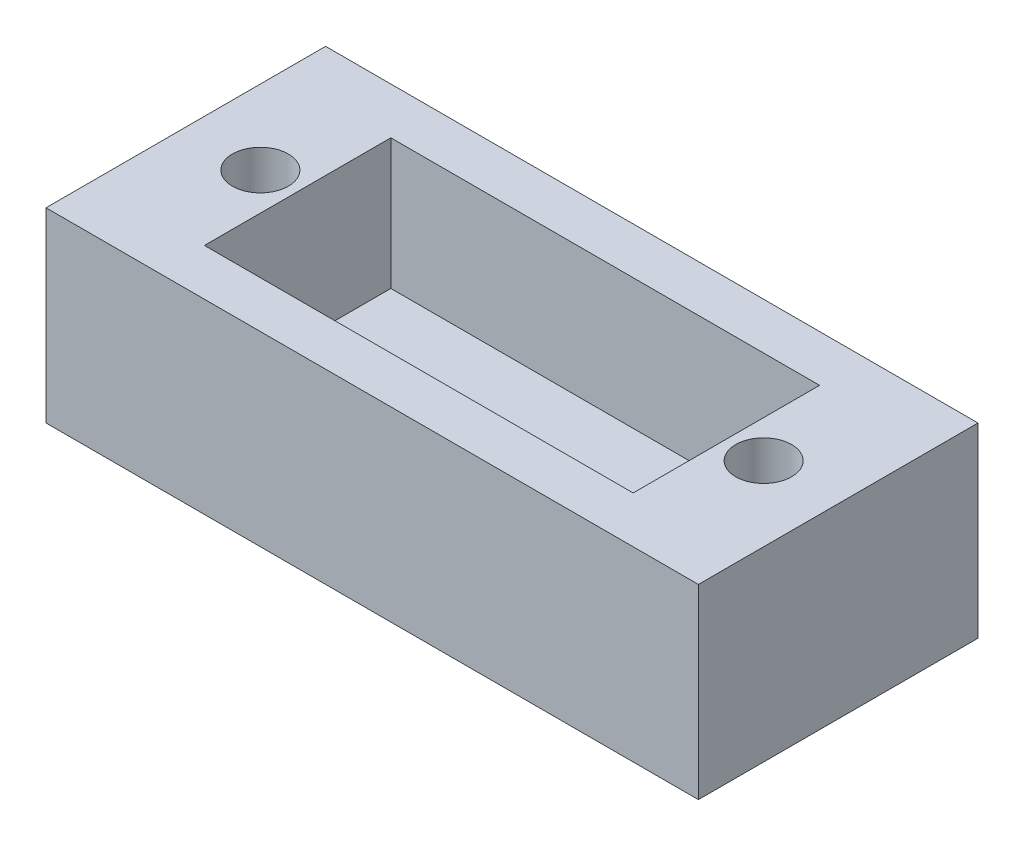
ISO-10303-21;
HEADER;
FILE_DESCRIPTION(('STEP AP214'),'2;1');
FILE_NAME('part.step','',(''),(''),'','','');
FILE_SCHEMA(('AUTOMOTIVE_DESIGN { 1 0 10303 214 1 1 1 1 }'));
ENDSEC;
DATA;
#1=APPLICATION_CONTEXT('core data for automotive mechanical design processes');
#2=APPLICATION_PROTOCOL_DEFINITION('international standard','automotive_design',2000,#1);
#3=PRODUCT_CONTEXT('',#1,'mechanical');
#4=PRODUCT('Part','Part','',(#3));
#5=PRODUCT_RELATED_PRODUCT_CATEGORY('part','',(#4));
#6=PRODUCT_DEFINITION_FORMATION('','',#4);
#7=PRODUCT_DEFINITION_CONTEXT('part definition',#1,'design');
#8=PRODUCT_DEFINITION('design','',#6,#7);
#9=PRODUCT_DEFINITION_SHAPE('','',#8);
#10=(LENGTH_UNIT() NAMED_UNIT(*) SI_UNIT(.MILLI.,.METRE.));
#11=(NAMED_UNIT(*) PLANE_ANGLE_UNIT() SI_UNIT($,.RADIAN.));
#12=(NAMED_UNIT(*) SI_UNIT($,.STERADIAN.) SOLID_ANGLE_UNIT());
#13=UNCERTAINTY_MEASURE_WITH_UNIT(LENGTH_MEASURE(1.E-05),#10,'distance_accuracy_value','');
#14=(GEOMETRIC_REPRESENTATION_CONTEXT(3) GLOBAL_UNCERTAINTY_ASSIGNED_CONTEXT((#13)) GLOBAL_UNIT_ASSIGNED_CONTEXT((#10,
#11,#12)) REPRESENTATION_CONTEXT('',''));
#15=CARTESIAN_POINT('',(0.,0.,0.));
#16=DIRECTION('',(0.,0.,1.));
#17=DIRECTION('',(1.,0.,0.));
#18=AXIS2_PLACEMENT_3D('',#15,#16,#17);
#19=CARTESIAN_POINT('',(0.,10.,7.5));
#20=DIRECTION('',(0.,0.,-1.));
#21=DIRECTION('',(-1.,0.,0.));
#22=AXIS2_PLACEMENT_3D('',#19,#20,#21);
#23=PLANE('',#22);
#24=DIRECTION('',(1.,0.,0.));
#25=VECTOR('',#24,1.);
#26=CARTESIAN_POINT('',(0.,0.,7.5));
#27=LINE('',#26,#25);
#28=CARTESIAN_POINT('',(-17.5,0.,7.5));
#29=VERTEX_POINT('',#28);
#30=CARTESIAN_POINT('',(17.5,0.,7.5));
#31=VERTEX_POINT('',#30);
#32=EDGE_CURVE('E156',#29,#31,#27,.T.);
#33=ORIENTED_EDGE('',*,*,#32,.T.);
#34=DIRECTION('',(0.,-1.,0.));
#35=VECTOR('',#34,1.);
#36=CARTESIAN_POINT('',(17.5,10.,7.5));
#37=LINE('',#36,#35);
#38=CARTESIAN_POINT('',(17.5,10.,7.5));
#39=VERTEX_POINT('',#38);
#40=EDGE_CURVE('E11',#39,#31,#37,.T.);
#41=ORIENTED_EDGE('',*,*,#40,.F.);
#42=DIRECTION('',(1.,0.,0.));
#43=VECTOR('',#42,1.);
#44=CARTESIAN_POINT('',(0.,10.,7.5));
#45=LINE('',#44,#43);
#46=CARTESIAN_POINT('',(-17.5,10.,7.5));
#47=VERTEX_POINT('',#46);
#48=EDGE_CURVE('E124',#47,#39,#45,.T.);
#49=ORIENTED_EDGE('',*,*,#48,.F.);
#50=DIRECTION('',(0.,-1.,0.));
#51=VECTOR('',#50,1.);
#52=CARTESIAN_POINT('',(-17.5,10.,7.5));
#53=LINE('',#52,#51);
#54=EDGE_CURVE('E72',#47,#29,#53,.T.);
#55=ORIENTED_EDGE('',*,*,#54,.T.);
#56=EDGE_LOOP('',(#33,#41,#49,#55));
#57=FACE_BOUND('',#56,.T.);
#58=ADVANCED_FACE('F45',(#57),#23,.F.);
#59=CARTESIAN_POINT('',(17.5,10.,0.));
#60=DIRECTION('',(-1.,0.,0.));
#61=DIRECTION('',(0.,0.,1.));
#62=AXIS2_PLACEMENT_3D('',#59,#60,#61);
#63=PLANE('',#62);
#64=DIRECTION('',(0.,0.,-1.));
#65=VECTOR('',#64,1.);
#66=CARTESIAN_POINT('',(17.5,0.,0.));
#67=LINE('',#66,#65);
#68=CARTESIAN_POINT('',(17.5,0.,-7.5));
#69=VERTEX_POINT('',#68);
#70=EDGE_CURVE('E131',#31,#69,#67,.T.);
#71=ORIENTED_EDGE('',*,*,#70,.T.);
#72=DIRECTION('',(0.,-1.,0.));
#73=VECTOR('',#72,1.);
#74=CARTESIAN_POINT('',(17.5,10.,-7.5));
#75=LINE('',#74,#73);
#76=CARTESIAN_POINT('',(17.5,10.,-7.5));
#77=VERTEX_POINT('',#76);
#78=EDGE_CURVE('E55',#77,#69,#75,.T.);
#79=ORIENTED_EDGE('',*,*,#78,.F.);
#80=DIRECTION('',(0.,0.,-1.));
#81=VECTOR('',#80,1.);
#82=CARTESIAN_POINT('',(17.5,10.,0.));
#83=LINE('',#82,#81);
#84=EDGE_CURVE('E118',#39,#77,#83,.T.);
#85=ORIENTED_EDGE('',*,*,#84,.F.);
#86=ORIENTED_EDGE('',*,*,#40,.T.);
#87=EDGE_LOOP('',(#71,#79,#85,#86));
#88=FACE_BOUND('',#87,.T.);
#89=ADVANCED_FACE('F130',(#88),#63,.F.);
#90=CARTESIAN_POINT('',(0.,10.,-7.5));
#91=DIRECTION('',(0.,0.,-1.));
#92=DIRECTION('',(-1.,0.,0.));
#93=AXIS2_PLACEMENT_3D('',#90,#91,#92);
#94=PLANE('',#93);
#95=DIRECTION('',(1.,0.,0.));
#96=VECTOR('',#95,1.);
#97=CARTESIAN_POINT('',(0.,0.,-7.5));
#98=LINE('',#97,#96);
#99=CARTESIAN_POINT('',(-17.5,0.,-7.5));
#100=VERTEX_POINT('',#99);
#101=EDGE_CURVE('E161',#100,#69,#98,.T.);
#102=ORIENTED_EDGE('',*,*,#101,.F.);
#103=DIRECTION('',(0.,-1.,0.));
#104=VECTOR('',#103,1.);
#105=CARTESIAN_POINT('',(-17.5,10.,-7.5));
#106=LINE('',#105,#104);
#107=CARTESIAN_POINT('',(-17.5,10.,-7.5));
#108=VERTEX_POINT('',#107);
#109=EDGE_CURVE('E136',#108,#100,#106,.T.);
#110=ORIENTED_EDGE('',*,*,#109,.F.);
#111=DIRECTION('',(1.,0.,0.));
#112=VECTOR('',#111,1.);
#113=CARTESIAN_POINT('',(0.,10.,-7.5));
#114=LINE('',#113,#112);
#115=EDGE_CURVE('E123',#108,#77,#114,.T.);
#116=ORIENTED_EDGE('',*,*,#115,.T.);
#117=ORIENTED_EDGE('',*,*,#78,.T.);
#118=EDGE_LOOP('',(#102,#110,#116,#117));
#119=FACE_BOUND('',#118,.T.);
#120=ADVANCED_FACE('F138',(#119),#94,.T.);
#121=CARTESIAN_POINT('',(11.5,10.,0.));
#122=DIRECTION('',(-1.,0.,0.));
#123=DIRECTION('',(0.,0.,1.));
#124=AXIS2_PLACEMENT_3D('',#121,#122,#123);
#125=PLANE('',#124);
#126=DIRECTION('',(0.,0.,-1.));
#127=VECTOR('',#126,1.);
#128=CARTESIAN_POINT('',(11.5,3.,0.));
#129=LINE('',#128,#127);
#130=CARTESIAN_POINT('',(11.5,3.,5.));
#131=VERTEX_POINT('',#130);
#132=CARTESIAN_POINT('',(11.5,3.,-5.));
#133=VERTEX_POINT('',#132);
#134=EDGE_CURVE('E63',#131,#133,#129,.T.);
#135=ORIENTED_EDGE('',*,*,#134,.F.);
#136=DIRECTION('',(0.,-1.,0.));
#137=VECTOR('',#136,1.);
#138=CARTESIAN_POINT('',(11.5,10.,5.));
#139=LINE('',#138,#137);
#140=CARTESIAN_POINT('',(11.5,10.,5.));
#141=VERTEX_POINT('',#140);
#142=EDGE_CURVE('E49',#141,#131,#139,.T.);
#143=ORIENTED_EDGE('',*,*,#142,.F.);
#144=DIRECTION('',(0.,0.,-1.));
#145=VECTOR('',#144,1.);
#146=CARTESIAN_POINT('',(11.5,10.,0.));
#147=LINE('',#146,#145);
#148=CARTESIAN_POINT('',(11.5,10.,-5.));
#149=VERTEX_POINT('',#148);
#150=EDGE_CURVE('E292',#141,#149,#147,.T.);
#151=ORIENTED_EDGE('',*,*,#150,.T.);
#152=DIRECTION('',(0.,-1.,0.));
#153=VECTOR('',#152,1.);
#154=CARTESIAN_POINT('',(11.5,10.,-5.));
#155=LINE('',#154,#153);
#156=EDGE_CURVE('E143',#149,#133,#155,.T.);
#157=ORIENTED_EDGE('',*,*,#156,.T.);
#158=EDGE_LOOP('',(#135,#143,#151,#157));
#159=FACE_BOUND('',#158,.T.);
#160=ADVANCED_FACE('F309',(#159),#125,.T.);
#161=CARTESIAN_POINT('',(0.,10.,5.));
#162=DIRECTION('',(0.,0.,-1.));
#163=DIRECTION('',(-1.,0.,0.));
#164=AXIS2_PLACEMENT_3D('',#161,#162,#163);
#165=PLANE('',#164);
#166=DIRECTION('',(1.,0.,0.));
#167=VECTOR('',#166,1.);
#168=CARTESIAN_POINT('',(0.,3.,5.));
#169=LINE('',#168,#167);
#170=CARTESIAN_POINT('',(-11.5,3.,5.));
#171=VERTEX_POINT('',#170);
#172=EDGE_CURVE('E191',#171,#131,#169,.T.);
#173=ORIENTED_EDGE('',*,*,#172,.F.);
#174=DIRECTION('',(0.,-1.,0.));
#175=VECTOR('',#174,1.);
#176=CARTESIAN_POINT('',(-11.5,10.,5.));
#177=LINE('',#176,#175);
#178=CARTESIAN_POINT('',(-11.5,10.,5.));
#179=VERTEX_POINT('',#178);
#180=EDGE_CURVE('E179',#179,#171,#177,.T.);
#181=ORIENTED_EDGE('',*,*,#180,.F.);
#182=DIRECTION('',(1.,0.,0.));
#183=VECTOR('',#182,1.);
#184=CARTESIAN_POINT('',(0.,10.,5.));
#185=LINE('',#184,#183);
#186=EDGE_CURVE('E193',#179,#141,#185,.T.);
#187=ORIENTED_EDGE('',*,*,#186,.T.);
#188=ORIENTED_EDGE('',*,*,#142,.T.);
#189=EDGE_LOOP('',(#173,#181,#187,#188));
#190=FACE_BOUND('',#189,.T.);
#191=ADVANCED_FACE('F190',(#190),#165,.T.);
#192=CARTESIAN_POINT('',(-11.5,10.,0.));
#193=DIRECTION('',(-1.,0.,0.));
#194=DIRECTION('',(0.,0.,1.));
#195=AXIS2_PLACEMENT_3D('',#192,#193,#194);
#196=PLANE('',#195);
#197=ORIENTED_EDGE('',*,*,#180,.T.);
#198=DIRECTION('',(0.,0.,-1.));
#199=VECTOR('',#198,1.);
#200=CARTESIAN_POINT('',(-11.5,3.,0.));
#201=LINE('',#200,#199);
#202=CARTESIAN_POINT('',(-11.5,3.,-5.));
#203=VERTEX_POINT('',#202);
#204=EDGE_CURVE('E262',#171,#203,#201,.T.);
#205=ORIENTED_EDGE('',*,*,#204,.T.);
#206=DIRECTION('',(0.,-1.,0.));
#207=VECTOR('',#206,1.);
#208=CARTESIAN_POINT('',(-11.5,10.,-5.));
#209=LINE('',#208,#207);
#210=CARTESIAN_POINT('',(-11.5,10.,-5.));
#211=VERTEX_POINT('',#210);
#212=EDGE_CURVE('E176',#211,#203,#209,.T.);
#213=ORIENTED_EDGE('',*,*,#212,.F.);
#214=DIRECTION('',(0.,0.,-1.));
#215=VECTOR('',#214,1.);
#216=CARTESIAN_POINT('',(-11.5,10.,0.));
#217=LINE('',#216,#215);
#218=EDGE_CURVE('E297',#179,#211,#217,.T.);
#219=ORIENTED_EDGE('',*,*,#218,.F.);
#220=EDGE_LOOP('',(#197,#205,#213,#219));
#221=FACE_BOUND('',#220,.T.);
#222=ADVANCED_FACE('F316',(#221),#196,.F.);
#223=CARTESIAN_POINT('',(0.,10.,-5.));
#224=DIRECTION('',(0.,0.,-1.));
#225=DIRECTION('',(-1.,0.,0.));
#226=AXIS2_PLACEMENT_3D('',#223,#224,#225);
#227=PLANE('',#226);
#228=ORIENTED_EDGE('',*,*,#212,.T.);
#229=DIRECTION('',(1.,0.,0.));
#230=VECTOR('',#229,1.);
#231=CARTESIAN_POINT('',(0.,3.,-5.));
#232=LINE('',#231,#230);
#233=EDGE_CURVE('E259',#203,#133,#232,.T.);
#234=ORIENTED_EDGE('',*,*,#233,.T.);
#235=ORIENTED_EDGE('',*,*,#156,.F.);
#236=DIRECTION('',(1.,0.,0.));
#237=VECTOR('',#236,1.);
#238=CARTESIAN_POINT('',(0.,10.,-5.));
#239=LINE('',#238,#237);
#240=EDGE_CURVE('E301',#211,#149,#239,.T.);
#241=ORIENTED_EDGE('',*,*,#240,.F.);
#242=EDGE_LOOP('',(#228,#234,#235,#241));
#243=FACE_BOUND('',#242,.T.);
#244=ADVANCED_FACE('F308',(#243),#227,.F.);
#245=CARTESIAN_POINT('',(13.5,10.,0.));
#246=DIRECTION('',(0.,-1.,0.));
#247=DIRECTION('',(0.,0.,-1.));
#248=AXIS2_PLACEMENT_3D('',#245,#246,#247);
#249=CYLINDRICAL_SURFACE('',#248,1.5);
#250=CARTESIAN_POINT('',(13.5,10.,0.));
#251=DIRECTION('',(0.,1.,0.));
#252=DIRECTION('',(0.,0.,1.));
#253=AXIS2_PLACEMENT_3D('',#250,#251,#252);
#254=CIRCLE('',#253,1.5);
#255=CARTESIAN_POINT('',(13.5,10.,1.5));
#256=VERTEX_POINT('',#255);
#257=EDGE_CURVE('E288',#256,#256,#254,.T.);
#258=ORIENTED_EDGE('',*,*,#257,.T.);
#259=EDGE_LOOP('',(#258));
#260=FACE_BOUND('',#259,.T.);
#261=CARTESIAN_POINT('',(13.5,0.,0.));
#262=DIRECTION('',(0.,1.,0.));
#263=DIRECTION('',(0.,0.,1.));
#264=AXIS2_PLACEMENT_3D('',#261,#262,#263);
#265=CIRCLE('',#264,1.5);
#266=CARTESIAN_POINT('',(13.5,0.,1.5));
#267=VERTEX_POINT('',#266);
#268=EDGE_CURVE('E151',#267,#267,#265,.T.);
#269=ORIENTED_EDGE('',*,*,#268,.F.);
#270=EDGE_LOOP('',(#269));
#271=FACE_BOUND('',#270,.T.);
#272=ADVANCED_FACE('F328',(#260,#271),#249,.F.);
#273=CARTESIAN_POINT('',(-13.5,10.,0.));
#274=DIRECTION('',(0.,-1.,0.));
#275=DIRECTION('',(0.,0.,-1.));
#276=AXIS2_PLACEMENT_3D('',#273,#274,#275);
#277=CYLINDRICAL_SURFACE('',#276,1.5);
#278=CARTESIAN_POINT('',(-13.5,10.,0.));
#279=DIRECTION('',(0.,1.,0.));
#280=DIRECTION('',(0.,0.,1.));
#281=AXIS2_PLACEMENT_3D('',#278,#279,#280);
#282=CIRCLE('',#281,1.5);
#283=CARTESIAN_POINT('',(-13.5,10.,1.5));
#284=VERTEX_POINT('',#283);
#285=EDGE_CURVE('E168',#284,#284,#282,.T.);
#286=ORIENTED_EDGE('',*,*,#285,.T.);
#287=EDGE_LOOP('',(#286));
#288=FACE_BOUND('',#287,.T.);
#289=CARTESIAN_POINT('',(-13.5,0.,0.));
#290=DIRECTION('',(0.,1.,0.));
#291=DIRECTION('',(0.,0.,1.));
#292=AXIS2_PLACEMENT_3D('',#289,#290,#291);
#293=CIRCLE('',#292,1.5);
#294=CARTESIAN_POINT('',(-13.5,0.,1.5));
#295=VERTEX_POINT('',#294);
#296=EDGE_CURVE('E147',#295,#295,#293,.T.);
#297=ORIENTED_EDGE('',*,*,#296,.F.);
#298=EDGE_LOOP('',(#297));
#299=FACE_BOUND('',#298,.T.);
#300=ADVANCED_FACE('F47',(#288,#299),#277,.F.);
#301=CARTESIAN_POINT('',(-17.5,10.,0.));
#302=DIRECTION('',(-1.,0.,0.));
#303=DIRECTION('',(0.,0.,1.));
#304=AXIS2_PLACEMENT_3D('',#301,#302,#303);
#305=PLANE('',#304);
#306=DIRECTION('',(0.,0.,-1.));
#307=VECTOR('',#306,1.);
#308=CARTESIAN_POINT('',(-17.5,0.,0.));
#309=LINE('',#308,#307);
#310=EDGE_CURVE('E164',#29,#100,#309,.T.);
#311=ORIENTED_EDGE('',*,*,#310,.F.);
#312=ORIENTED_EDGE('',*,*,#54,.F.);
#313=DIRECTION('',(0.,0.,-1.));
#314=VECTOR('',#313,1.);
#315=CARTESIAN_POINT('',(-17.5,10.,0.));
#316=LINE('',#315,#314);
#317=EDGE_CURVE('E140',#47,#108,#316,.T.);
#318=ORIENTED_EDGE('',*,*,#317,.T.);
#319=ORIENTED_EDGE('',*,*,#109,.T.);
#320=EDGE_LOOP('',(#311,#312,#318,#319));
#321=FACE_BOUND('',#320,.T.);
#322=ADVANCED_FACE('F352',(#321),#305,.T.);
#323=CARTESIAN_POINT('',(0.,10.,0.));
#324=DIRECTION('',(0.,1.,0.));
#325=DIRECTION('',(0.,0.,1.));
#326=AXIS2_PLACEMENT_3D('',#323,#324,#325);
#327=PLANE('',#326);
#328=ORIENTED_EDGE('',*,*,#285,.F.);
#329=EDGE_LOOP('',(#328));
#330=FACE_BOUND('',#329,.T.);
#331=ORIENTED_EDGE('',*,*,#257,.F.);
#332=EDGE_LOOP('',(#331));
#333=FACE_BOUND('',#332,.T.);
#334=ORIENTED_EDGE('',*,*,#150,.F.);
#335=ORIENTED_EDGE('',*,*,#186,.F.);
#336=ORIENTED_EDGE('',*,*,#218,.T.);
#337=ORIENTED_EDGE('',*,*,#240,.T.);
#338=EDGE_LOOP('',(#334,#335,#336,#337));
#339=FACE_BOUND('',#338,.T.);
#340=ORIENTED_EDGE('',*,*,#48,.T.);
#341=ORIENTED_EDGE('',*,*,#84,.T.);
#342=ORIENTED_EDGE('',*,*,#115,.F.);
#343=ORIENTED_EDGE('',*,*,#317,.F.);
#344=EDGE_LOOP('',(#340,#341,#342,#343));
#345=FACE_BOUND('',#344,.T.);
#346=ADVANCED_FACE('F120',(#330,#333,#339,#345),#327,.T.);
#347=CARTESIAN_POINT('',(0.,0.,0.));
#348=DIRECTION('',(0.,1.,0.));
#349=DIRECTION('',(0.,0.,1.));
#350=AXIS2_PLACEMENT_3D('',#347,#348,#349);
#351=PLANE('',#350);
#352=ORIENTED_EDGE('',*,*,#296,.T.);
#353=EDGE_LOOP('',(#352));
#354=FACE_BOUND('',#353,.T.);
#355=ORIENTED_EDGE('',*,*,#268,.T.);
#356=EDGE_LOOP('',(#355));
#357=FACE_BOUND('',#356,.T.);
#358=ORIENTED_EDGE('',*,*,#32,.F.);
#359=ORIENTED_EDGE('',*,*,#310,.T.);
#360=ORIENTED_EDGE('',*,*,#101,.T.);
#361=ORIENTED_EDGE('',*,*,#70,.F.);
#362=EDGE_LOOP('',(#358,#359,#360,#361));
#363=FACE_BOUND('',#362,.T.);
#364=DIRECTION('',(0.,0.,-1.));
#365=VECTOR('',#364,1.);
#366=CARTESIAN_POINT('',(10.,0.,0.));
#367=LINE('',#366,#365);
#368=CARTESIAN_POINT('',(10.,0.,2.));
#369=VERTEX_POINT('',#368);
#370=CARTESIAN_POINT('',(10.,0.,-2.));
#371=VERTEX_POINT('',#370);
#372=EDGE_CURVE('E265',#369,#371,#367,.T.);
#373=ORIENTED_EDGE('',*,*,#372,.T.);
#374=DIRECTION('',(1.,0.,0.));
#375=VECTOR('',#374,1.);
#376=CARTESIAN_POINT('',(0.,0.,-2.));
#377=LINE('',#376,#375);
#378=CARTESIAN_POINT('',(-10.,0.,-2.));
#379=VERTEX_POINT('',#378);
#380=EDGE_CURVE('E275',#379,#371,#377,.T.);
#381=ORIENTED_EDGE('',*,*,#380,.F.);
#382=DIRECTION('',(0.,0.,-1.));
#383=VECTOR('',#382,1.);
#384=CARTESIAN_POINT('',(-10.,0.,0.));
#385=LINE('',#384,#383);
#386=CARTESIAN_POINT('',(-10.,0.,2.));
#387=VERTEX_POINT('',#386);
#388=EDGE_CURVE('E215',#387,#379,#385,.T.);
#389=ORIENTED_EDGE('',*,*,#388,.F.);
#390=DIRECTION('',(1.,0.,0.));
#391=VECTOR('',#390,1.);
#392=CARTESIAN_POINT('',(0.,0.,2.));
#393=LINE('',#392,#391);
#394=EDGE_CURVE('E269',#387,#369,#393,.T.);
#395=ORIENTED_EDGE('',*,*,#394,.T.);
#396=EDGE_LOOP('',(#373,#381,#389,#395));
#397=FACE_BOUND('',#396,.T.);
#398=ADVANCED_FACE('F365',(#354,#357,#363,#397),#351,.F.);
#399=CARTESIAN_POINT('',(10.,3.,0.));
#400=DIRECTION('',(-1.,0.,0.));
#401=DIRECTION('',(0.,0.,1.));
#402=AXIS2_PLACEMENT_3D('',#399,#400,#401);
#403=PLANE('',#402);
#404=ORIENTED_EDGE('',*,*,#372,.F.);
#405=DIRECTION('',(0.,-1.,0.));
#406=VECTOR('',#405,1.);
#407=CARTESIAN_POINT('',(10.,3.,2.));
#408=LINE('',#407,#406);
#409=CARTESIAN_POINT('',(10.,3.,2.));
#410=VERTEX_POINT('',#409);
#411=EDGE_CURVE('E152',#410,#369,#408,.T.);
#412=ORIENTED_EDGE('',*,*,#411,.F.);
#413=DIRECTION('',(0.,0.,-1.));
#414=VECTOR('',#413,1.);
#415=CARTESIAN_POINT('',(10.,3.,0.));
#416=LINE('',#415,#414);
#417=CARTESIAN_POINT('',(10.,3.,-2.));
#418=VERTEX_POINT('',#417);
#419=EDGE_CURVE('E278',#410,#418,#416,.T.);
#420=ORIENTED_EDGE('',*,*,#419,.T.);
#421=DIRECTION('',(0.,-1.,0.));
#422=VECTOR('',#421,1.);
#423=CARTESIAN_POINT('',(10.,3.,-2.));
#424=LINE('',#423,#422);
#425=EDGE_CURVE('E223',#418,#371,#424,.T.);
#426=ORIENTED_EDGE('',*,*,#425,.T.);
#427=EDGE_LOOP('',(#404,#412,#420,#426));
#428=FACE_BOUND('',#427,.T.);
#429=ADVANCED_FACE('F372',(#428),#403,.T.);
#430=CARTESIAN_POINT('',(0.,3.,2.));
#431=DIRECTION('',(0.,0.,-1.));
#432=DIRECTION('',(-1.,0.,0.));
#433=AXIS2_PLACEMENT_3D('',#430,#431,#432);
#434=PLANE('',#433);
#435=ORIENTED_EDGE('',*,*,#394,.F.);
#436=DIRECTION('',(0.,-1.,0.));
#437=VECTOR('',#436,1.);
#438=CARTESIAN_POINT('',(-10.,3.,2.));
#439=LINE('',#438,#437);
#440=CARTESIAN_POINT('',(-10.,3.,2.));
#441=VERTEX_POINT('',#440);
#442=EDGE_CURVE('E248',#441,#387,#439,.T.);
#443=ORIENTED_EDGE('',*,*,#442,.F.);
#444=DIRECTION('',(1.,0.,0.));
#445=VECTOR('',#444,1.);
#446=CARTESIAN_POINT('',(0.,3.,2.));
#447=LINE('',#446,#445);
#448=EDGE_CURVE('E240',#441,#410,#447,.T.);
#449=ORIENTED_EDGE('',*,*,#448,.T.);
#450=ORIENTED_EDGE('',*,*,#411,.T.);
#451=EDGE_LOOP('',(#435,#443,#449,#450));
#452=FACE_BOUND('',#451,.T.);
#453=ADVANCED_FACE('F380',(#452),#434,.T.);
#454=CARTESIAN_POINT('',(-10.,3.,0.));
#455=DIRECTION('',(-1.,0.,0.));
#456=DIRECTION('',(0.,0.,1.));
#457=AXIS2_PLACEMENT_3D('',#454,#455,#456);
#458=PLANE('',#457);
#459=ORIENTED_EDGE('',*,*,#388,.T.);
#460=DIRECTION('',(0.,-1.,0.));
#461=VECTOR('',#460,1.);
#462=CARTESIAN_POINT('',(-10.,3.,-2.));
#463=LINE('',#462,#461);
#464=CARTESIAN_POINT('',(-10.,3.,-2.));
#465=VERTEX_POINT('',#464);
#466=EDGE_CURVE('E243',#465,#379,#463,.T.);
#467=ORIENTED_EDGE('',*,*,#466,.F.);
#468=DIRECTION('',(0.,0.,-1.));
#469=VECTOR('',#468,1.);
#470=CARTESIAN_POINT('',(-10.,3.,0.));
#471=LINE('',#470,#469);
#472=EDGE_CURVE('E235',#441,#465,#471,.T.);
#473=ORIENTED_EDGE('',*,*,#472,.F.);
#474=ORIENTED_EDGE('',*,*,#442,.T.);
#475=EDGE_LOOP('',(#459,#467,#473,#474));
#476=FACE_BOUND('',#475,.T.);
#477=ADVANCED_FACE('F244',(#476),#458,.F.);
#478=CARTESIAN_POINT('',(0.,3.,-2.));
#479=DIRECTION('',(0.,0.,-1.));
#480=DIRECTION('',(-1.,0.,0.));
#481=AXIS2_PLACEMENT_3D('',#478,#479,#480);
#482=PLANE('',#481);
#483=ORIENTED_EDGE('',*,*,#380,.T.);
#484=ORIENTED_EDGE('',*,*,#425,.F.);
#485=DIRECTION('',(1.,0.,0.));
#486=VECTOR('',#485,1.);
#487=CARTESIAN_POINT('',(0.,3.,-2.));
#488=LINE('',#487,#486);
#489=EDGE_CURVE('E238',#465,#418,#488,.T.);
#490=ORIENTED_EDGE('',*,*,#489,.F.);
#491=ORIENTED_EDGE('',*,*,#466,.T.);
#492=EDGE_LOOP('',(#483,#484,#490,#491));
#493=FACE_BOUND('',#492,.T.);
#494=ADVANCED_FACE('F250',(#493),#482,.F.);
#495=CARTESIAN_POINT('',(0.,3.,0.));
#496=DIRECTION('',(0.,1.,0.));
#497=DIRECTION('',(0.,0.,1.));
#498=AXIS2_PLACEMENT_3D('',#495,#496,#497);
#499=PLANE('',#498);
#500=ORIENTED_EDGE('',*,*,#419,.F.);
#501=ORIENTED_EDGE('',*,*,#448,.F.);
#502=ORIENTED_EDGE('',*,*,#472,.T.);
#503=ORIENTED_EDGE('',*,*,#489,.T.);
#504=EDGE_LOOP('',(#500,#501,#502,#503));
#505=FACE_BOUND('',#504,.T.);
#506=ORIENTED_EDGE('',*,*,#172,.T.);
#507=ORIENTED_EDGE('',*,*,#134,.T.);
#508=ORIENTED_EDGE('',*,*,#233,.F.);
#509=ORIENTED_EDGE('',*,*,#204,.F.);
#510=EDGE_LOOP('',(#506,#507,#508,#509));
#511=FACE_BOUND('',#510,.T.);
#512=ADVANCED_FACE('F236',(#505,#511),#499,.T.);
#513=CLOSED_SHELL('',(#58,#89,#120,#160,#191,#222,#244,#272,#300,#322,#346,#398,#429,#453,#477,
#494,#512));
#514=MANIFOLD_SOLID_BREP('B2',#513);
#515=ADVANCED_BREP_SHAPE_REPRESENTATION('',(#18,#514),#14);
#516=SHAPE_DEFINITION_REPRESENTATION(#9,#515);
ENDSEC;
END-ISO-10303-21;
